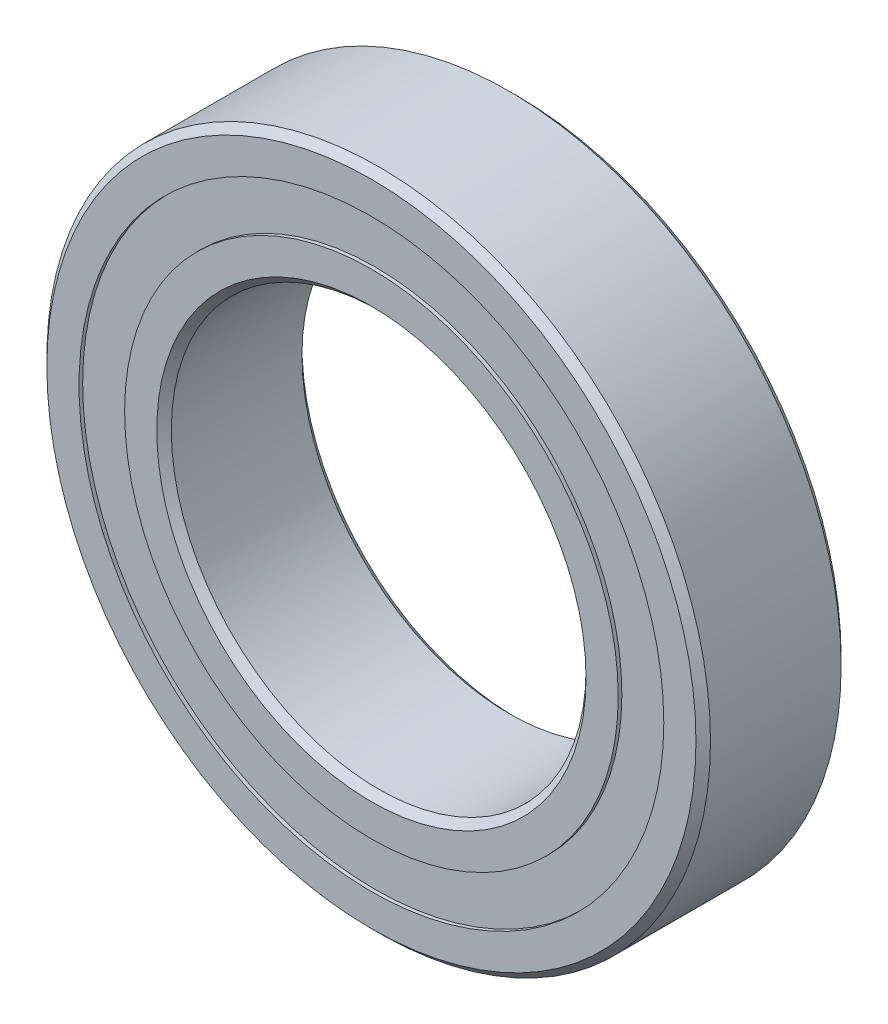
ISO-10303-21;
HEADER;
FILE_DESCRIPTION(('STEP AP214'),'2;1');
FILE_NAME('part.step','',(''),(''),'','','');
FILE_SCHEMA(('AUTOMOTIVE_DESIGN { 1 0 10303 214 1 1 1 1 }'));
ENDSEC;
DATA;
#1=APPLICATION_CONTEXT('core data for automotive mechanical design processes');
#2=APPLICATION_PROTOCOL_DEFINITION('international standard','automotive_design',2000,#1);
#3=PRODUCT_CONTEXT('',#1,'mechanical');
#4=PRODUCT('Part','Part','',(#3));
#5=PRODUCT_RELATED_PRODUCT_CATEGORY('part','',(#4));
#6=PRODUCT_DEFINITION_FORMATION('','',#4);
#7=PRODUCT_DEFINITION_CONTEXT('part definition',#1,'design');
#8=PRODUCT_DEFINITION('design','',#6,#7);
#9=PRODUCT_DEFINITION_SHAPE('','',#8);
#10=(LENGTH_UNIT() NAMED_UNIT(*) SI_UNIT(.MILLI.,.METRE.));
#11=(NAMED_UNIT(*) PLANE_ANGLE_UNIT() SI_UNIT($,.RADIAN.));
#12=(NAMED_UNIT(*) SI_UNIT($,.STERADIAN.) SOLID_ANGLE_UNIT());
#13=UNCERTAINTY_MEASURE_WITH_UNIT(LENGTH_MEASURE(1.E-05),#10,'distance_accuracy_value','');
#14=(GEOMETRIC_REPRESENTATION_CONTEXT(3) GLOBAL_UNCERTAINTY_ASSIGNED_CONTEXT((#13)) GLOBAL_UNIT_ASSIGNED_CONTEXT((#10,
#11,#12)) REPRESENTATION_CONTEXT('',''));
#15=CARTESIAN_POINT('',(0.,0.,0.));
#16=DIRECTION('',(0.,0.,1.));
#17=DIRECTION('',(1.,0.,0.));
#18=AXIS2_PLACEMENT_3D('',#15,#16,#17);
#19=CARTESIAN_POINT('',(-6.49999999999986,11.2583302491978,0.));
#20=DIRECTION('',(0.,0.,1.));
#21=DIRECTION('',(-0.499999999999989,0.866025403784445,0.));
#22=AXIS2_PLACEMENT_3D('',#19,#20,#21);
#23=SPHERICAL_SURFACE('',#22,1.90455682813241);
#24=CARTESIAN_POINT('',(-6.49999999999986,11.2583302491978,1.90455682813241));
#25=VERTEX_POINT('',#24);
#26=VERTEX_LOOP('',#25);
#27=FACE_BOUND('',#26,.T.);
#28=ADVANCED_FACE('F37',(#27),#23,.T.);
#29=CLOSED_SHELL('',(#28));
#30=MANIFOLD_SOLID_BREP('B2',#29);
#31=CARTESIAN_POINT('',(-11.2583302491976,6.50000000000013,0.));
#32=DIRECTION('',(0.,0.,1.));
#33=DIRECTION('',(-0.866025403784433,0.50000000000001,0.));
#34=AXIS2_PLACEMENT_3D('',#31,#32,#33);
#35=SPHERICAL_SURFACE('',#34,1.90455682813241);
#36=CARTESIAN_POINT('',(-11.2583302491976,6.50000000000013,1.90455682813241));
#37=VERTEX_POINT('',#36);
#38=VERTEX_LOOP('',#37);
#39=FACE_BOUND('',#38,.T.);
#40=ADVANCED_FACE('F57',(#39),#35,.T.);
#41=CLOSED_SHELL('',(#40));
#42=MANIFOLD_SOLID_BREP('B6',#41);
#43=CARTESIAN_POINT('',(-13.,1.36167772214882E-13,0.));
#44=DIRECTION('',(0.,0.,1.));
#45=DIRECTION('',(-1.,0.,0.));
#46=AXIS2_PLACEMENT_3D('',#43,#44,#45);
#47=SPHERICAL_SURFACE('',#46,1.90455682813241);
#48=CARTESIAN_POINT('',(-13.,1.36167772214882E-13,1.90455682813241));
#49=VERTEX_POINT('',#48);
#50=VERTEX_LOOP('',#49);
#51=FACE_BOUND('',#50,.T.);
#52=ADVANCED_FACE('F77',(#51),#47,.T.);
#53=CLOSED_SHELL('',(#52));
#54=MANIFOLD_SOLID_BREP('B33',#53);
#55=CARTESIAN_POINT('',(-11.2583302491978,-6.4999999999999,0.));
#56=DIRECTION('',(0.,0.,1.));
#57=DIRECTION('',(-0.866025403784443,-0.499999999999992,0.));
#58=AXIS2_PLACEMENT_3D('',#55,#56,#57);
#59=SPHERICAL_SURFACE('',#58,1.90455682813241);
#60=CARTESIAN_POINT('',(-11.2583302491978,-6.4999999999999,1.90455682813241));
#61=VERTEX_POINT('',#60);
#62=VERTEX_LOOP('',#61);
#63=FACE_BOUND('',#62,.T.);
#64=ADVANCED_FACE('F97',(#63),#59,.T.);
#65=CLOSED_SHELL('',(#64));
#66=MANIFOLD_SOLID_BREP('B53',#65);
#67=CARTESIAN_POINT('',(-6.50000000000009,-11.2583302491977,0.));
#68=DIRECTION('',(0.,0.,1.));
#69=DIRECTION('',(-0.500000000000007,-0.866025403784435,0.));
#70=AXIS2_PLACEMENT_3D('',#67,#68,#69);
#71=SPHERICAL_SURFACE('',#70,1.90455682813241);
#72=CARTESIAN_POINT('',(-6.50000000000009,-11.2583302491977,1.90455682813241));
#73=VERTEX_POINT('',#72);
#74=VERTEX_LOOP('',#73);
#75=FACE_BOUND('',#74,.T.);
#76=ADVANCED_FACE('F117',(#75),#71,.T.);
#77=CLOSED_SHELL('',(#76));
#78=MANIFOLD_SOLID_BREP('B73',#77);
#79=CARTESIAN_POINT('',(0.,-13.,0.));
#80=DIRECTION('',(0.,0.,1.));
#81=DIRECTION('',(0.,-1.,0.));
#82=AXIS2_PLACEMENT_3D('',#79,#80,#81);
#83=SPHERICAL_SURFACE('',#82,1.90455682813241);
#84=CARTESIAN_POINT('',(0.,-13.,1.90455682813241));
#85=VERTEX_POINT('',#84);
#86=VERTEX_LOOP('',#85);
#87=FACE_BOUND('',#86,.T.);
#88=ADVANCED_FACE('F137',(#87),#83,.T.);
#89=CLOSED_SHELL('',(#88));
#90=MANIFOLD_SOLID_BREP('B93',#89);
#91=CARTESIAN_POINT('',(6.49999999999994,-11.2583302491977,0.));
#92=DIRECTION('',(0.,0.,1.));
#93=DIRECTION('',(0.499999999999995,-0.866025403784442,0.));
#94=AXIS2_PLACEMENT_3D('',#91,#92,#93);
#95=SPHERICAL_SURFACE('',#94,1.90455682813241);
#96=CARTESIAN_POINT('',(6.49999999999994,-11.2583302491977,1.90455682813241));
#97=VERTEX_POINT('',#96);
#98=VERTEX_LOOP('',#97);
#99=FACE_BOUND('',#98,.T.);
#100=ADVANCED_FACE('F157',(#99),#95,.T.);
#101=CLOSED_SHELL('',(#100));
#102=MANIFOLD_SOLID_BREP('B113',#101);
#103=CARTESIAN_POINT('',(11.2583302491977,-6.50000000000006,0.));
#104=DIRECTION('',(0.,0.,1.));
#105=DIRECTION('',(0.866025403784436,-0.500000000000004,0.));
#106=AXIS2_PLACEMENT_3D('',#103,#104,#105);
#107=SPHERICAL_SURFACE('',#106,1.90455682813241);
#108=CARTESIAN_POINT('',(11.2583302491977,-6.50000000000006,1.90455682813241));
#109=VERTEX_POINT('',#108);
#110=VERTEX_LOOP('',#109);
#111=FACE_BOUND('',#110,.T.);
#112=ADVANCED_FACE('F177',(#111),#107,.T.);
#113=CLOSED_SHELL('',(#112));
#114=MANIFOLD_SOLID_BREP('B133',#113);
#115=CARTESIAN_POINT('',(13.,0.,0.));
#116=DIRECTION('',(0.,0.,1.));
#117=DIRECTION('',(1.,0.,0.));
#118=AXIS2_PLACEMENT_3D('',#115,#116,#117);
#119=SPHERICAL_SURFACE('',#118,1.90455682813241);
#120=CARTESIAN_POINT('',(13.,0.,1.90455682813241));
#121=VERTEX_POINT('',#120);
#122=VERTEX_LOOP('',#121);
#123=FACE_BOUND('',#122,.T.);
#124=ADVANCED_FACE('F197',(#123),#119,.T.);
#125=CLOSED_SHELL('',(#124));
#126=MANIFOLD_SOLID_BREP('B153',#125);
#127=CARTESIAN_POINT('',(11.2583302491977,6.49999999999998,0.));
#128=DIRECTION('',(0.,0.,1.));
#129=DIRECTION('',(0.86602540378444,0.499999999999998,0.));
#130=AXIS2_PLACEMENT_3D('',#127,#128,#129);
#131=SPHERICAL_SURFACE('',#130,1.90455682813241);
#132=CARTESIAN_POINT('',(11.2583302491977,6.49999999999998,1.90455682813241));
#133=VERTEX_POINT('',#132);
#134=VERTEX_LOOP('',#133);
#135=FACE_BOUND('',#134,.T.);
#136=ADVANCED_FACE('F217',(#135),#131,.T.);
#137=CLOSED_SHELL('',(#136));
#138=MANIFOLD_SOLID_BREP('B173',#137);
#139=CARTESIAN_POINT('',(6.50000000000002,11.2583302491977,0.));
#140=DIRECTION('',(0.,0.,1.));
#141=DIRECTION('',(0.500000000000001,0.866025403784438,0.));
#142=AXIS2_PLACEMENT_3D('',#139,#140,#141);
#143=SPHERICAL_SURFACE('',#142,1.90455682813241);
#144=CARTESIAN_POINT('',(6.50000000000002,11.2583302491977,1.90455682813241));
#145=VERTEX_POINT('',#144);
#146=VERTEX_LOOP('',#145);
#147=FACE_BOUND('',#146,.T.);
#148=ADVANCED_FACE('F237',(#147),#143,.T.);
#149=CLOSED_SHELL('',(#148));
#150=MANIFOLD_SOLID_BREP('B193',#149);
#151=CARTESIAN_POINT('',(0.,13.,0.));
#152=DIRECTION('',(0.,0.,1.));
#153=DIRECTION('',(0.,1.,0.));
#154=AXIS2_PLACEMENT_3D('',#151,#152,#153);
#155=SPHERICAL_SURFACE('',#154,1.90455682813241);
#156=CARTESIAN_POINT('',(0.,13.,1.90455682813241));
#157=VERTEX_POINT('',#156);
#158=VERTEX_LOOP('',#157);
#159=FACE_BOUND('',#158,.T.);
#160=ADVANCED_FACE('F258',(#159),#155,.T.);
#161=CLOSED_SHELL('',(#160));
#162=MANIFOLD_SOLID_BREP('B213',#161);
#163=CARTESIAN_POINT('',(0.,0.,3.5));
#164=DIRECTION('',(0.,0.,1.));
#165=DIRECTION('',(1.,0.,0.));
#166=AXIS2_PLACEMENT_3D('',#163,#164,#165);
#167=CYLINDRICAL_SURFACE('',#166,14.0989010989011);
#168=CARTESIAN_POINT('',(0.,0.,-3.5));
#169=DIRECTION('',(0.,0.,1.));
#170=DIRECTION('',(1.,0.,0.));
#171=AXIS2_PLACEMENT_3D('',#168,#169,#170);
#172=CIRCLE('',#171,14.0989010989011);
#173=CARTESIAN_POINT('',(14.0989010989011,0.,-3.5));
#174=VERTEX_POINT('',#173);
#175=EDGE_CURVE('E310',#174,#174,#172,.T.);
#176=ORIENTED_EDGE('',*,*,#175,.F.);
#177=EDGE_LOOP('',(#176));
#178=FACE_BOUND('',#177,.T.);
#179=CARTESIAN_POINT('',(0.,0.,-3.32500000000001));
#180=DIRECTION('',(0.,0.,1.));
#181=DIRECTION('',(1.,0.,0.));
#182=AXIS2_PLACEMENT_3D('',#179,#180,#181);
#183=CIRCLE('',#182,14.0989010989011);
#184=CARTESIAN_POINT('',(14.0989010989011,0.,-3.32500000000001));
#185=VERTEX_POINT('',#184);
#186=EDGE_CURVE('E257',#185,#185,#183,.F.);
#187=ORIENTED_EDGE('',*,*,#186,.F.);
#188=EDGE_LOOP('',(#187));
#189=FACE_BOUND('',#188,.T.);
#190=ADVANCED_FACE('F271',(#178,#189),#167,.F.);
#191=CARTESIAN_POINT('',(0.,0.,3.5));
#192=DIRECTION('',(0.,0.,1.));
#193=DIRECTION('',(1.,0.,0.));
#194=AXIS2_PLACEMENT_3D('',#191,#192,#193);
#195=CYLINDRICAL_SURFACE('',#194,11.9010989010989);
#196=CARTESIAN_POINT('',(0.,0.,-3.5));
#197=DIRECTION('',(0.,0.,1.));
#198=DIRECTION('',(1.,0.,0.));
#199=AXIS2_PLACEMENT_3D('',#196,#197,#198);
#200=CIRCLE('',#199,11.9010989010989);
#201=CARTESIAN_POINT('',(11.9010989010989,0.,-3.5));
#202=VERTEX_POINT('',#201);
#203=EDGE_CURVE('E337',#202,#202,#200,.T.);
#204=ORIENTED_EDGE('',*,*,#203,.T.);
#205=EDGE_LOOP('',(#204));
#206=FACE_BOUND('',#205,.T.);
#207=CARTESIAN_POINT('',(0.,0.,-3.32500000000001));
#208=DIRECTION('',(0.,0.,1.));
#209=DIRECTION('',(1.,0.,0.));
#210=AXIS2_PLACEMENT_3D('',#207,#208,#209);
#211=CIRCLE('',#210,11.9010989010989);
#212=CARTESIAN_POINT('',(11.9010989010989,0.,-3.32500000000001));
#213=VERTEX_POINT('',#212);
#214=EDGE_CURVE('E283',#213,#213,#211,.T.);
#215=ORIENTED_EDGE('',*,*,#214,.F.);
#216=EDGE_LOOP('',(#215));
#217=FACE_BOUND('',#216,.T.);
#218=ADVANCED_FACE('F379',(#206,#217),#195,.T.);
#219=CARTESIAN_POINT('',(0.,0.,3.5));
#220=DIRECTION('',(0.,0.,1.));
#221=DIRECTION('',(1.,0.,0.));
#222=AXIS2_PLACEMENT_3D('',#219,#220,#221);
#223=CYLINDRICAL_SURFACE('',#222,14.0989010989011);
#224=CARTESIAN_POINT('',(0.,0.,3.5));
#225=DIRECTION('',(0.,0.,1.));
#226=DIRECTION('',(1.,0.,0.));
#227=AXIS2_PLACEMENT_3D('',#224,#225,#226);
#228=CIRCLE('',#227,14.0989010989011);
#229=CARTESIAN_POINT('',(14.0989010989011,0.,3.5));
#230=VERTEX_POINT('',#229);
#231=EDGE_CURVE('E301',#230,#230,#228,.T.);
#232=ORIENTED_EDGE('',*,*,#231,.T.);
#233=EDGE_LOOP('',(#232));
#234=FACE_BOUND('',#233,.T.);
#235=CARTESIAN_POINT('',(0.,0.,3.32500000000001));
#236=DIRECTION('',(0.,0.,-1.));
#237=DIRECTION('',(-1.,0.,0.));
#238=AXIS2_PLACEMENT_3D('',#235,#236,#237);
#239=CIRCLE('',#238,14.0989010989011);
#240=CARTESIAN_POINT('',(-14.0989010989011,0.,3.32500000000001));
#241=VERTEX_POINT('',#240);
#242=EDGE_CURVE('E292',#241,#241,#239,.F.);
#243=ORIENTED_EDGE('',*,*,#242,.F.);
#244=EDGE_LOOP('',(#243));
#245=FACE_BOUND('',#244,.T.);
#246=ADVANCED_FACE('F377',(#234,#245),#223,.F.);
#247=CARTESIAN_POINT('',(0.,0.,3.15));
#248=DIRECTION('',(0.,0.,-1.));
#249=DIRECTION('',(-1.,0.,0.));
#250=AXIS2_PLACEMENT_3D('',#247,#248,#249);
#251=CONICAL_SURFACE('',#250,16.,0.78539816339743);
#252=CARTESIAN_POINT('',(0.,0.,3.5));
#253=DIRECTION('',(0.,0.,1.));
#254=DIRECTION('',(1.,0.,0.));
#255=AXIS2_PLACEMENT_3D('',#252,#253,#254);
#256=CIRCLE('',#255,15.65);
#257=CARTESIAN_POINT('',(15.65,0.,3.5));
#258=VERTEX_POINT('',#257);
#259=EDGE_CURVE('E298',#258,#258,#256,.T.);
#260=ORIENTED_EDGE('',*,*,#259,.F.);
#261=EDGE_LOOP('',(#260));
#262=FACE_BOUND('',#261,.T.);
#263=CARTESIAN_POINT('',(0.,0.,3.15));
#264=DIRECTION('',(0.,0.,1.));
#265=DIRECTION('',(1.,0.,0.));
#266=AXIS2_PLACEMENT_3D('',#263,#264,#265);
#267=CIRCLE('',#266,16.);
#268=CARTESIAN_POINT('',(16.,0.,3.15));
#269=VERTEX_POINT('',#268);
#270=EDGE_CURVE('E319',#269,#269,#267,.T.);
#271=ORIENTED_EDGE('',*,*,#270,.T.);
#272=EDGE_LOOP('',(#271));
#273=FACE_BOUND('',#272,.T.);
#274=ADVANCED_FACE('F273',(#262,#273),#251,.T.);
#275=CARTESIAN_POINT('',(0.,15.65,3.5));
#276=DIRECTION('',(0.,0.,-1.));
#277=DIRECTION('',(-1.,0.,0.));
#278=AXIS2_PLACEMENT_3D('',#275,#276,#277);
#279=PLANE('',#278);
#280=ORIENTED_EDGE('',*,*,#231,.F.);
#281=EDGE_LOOP('',(#280));
#282=FACE_BOUND('',#281,.T.);
#283=ORIENTED_EDGE('',*,*,#259,.T.);
#284=EDGE_LOOP('',(#283));
#285=FACE_BOUND('',#284,.T.);
#286=ADVANCED_FACE('F387',(#282,#285),#279,.F.);
#287=CARTESIAN_POINT('',(0.,15.65,-3.5));
#288=DIRECTION('',(0.,0.,1.));
#289=DIRECTION('',(1.,0.,0.));
#290=AXIS2_PLACEMENT_3D('',#287,#288,#289);
#291=PLANE('',#290);
#292=CARTESIAN_POINT('',(0.,0.,-3.5));
#293=DIRECTION('',(0.,0.,1.));
#294=DIRECTION('',(1.,0.,0.));
#295=AXIS2_PLACEMENT_3D('',#292,#293,#294);
#296=CIRCLE('',#295,15.65);
#297=CARTESIAN_POINT('',(15.65,0.,-3.5));
#298=VERTEX_POINT('',#297);
#299=EDGE_CURVE('E313',#298,#298,#296,.T.);
#300=ORIENTED_EDGE('',*,*,#299,.F.);
#301=EDGE_LOOP('',(#300));
#302=FACE_BOUND('',#301,.T.);
#303=ORIENTED_EDGE('',*,*,#175,.T.);
#304=EDGE_LOOP('',(#303));
#305=FACE_BOUND('',#304,.T.);
#306=ADVANCED_FACE('F449',(#302,#305),#291,.F.);
#307=CARTESIAN_POINT('',(0.,0.,-3.5));
#308=DIRECTION('',(0.,0.,1.));
#309=DIRECTION('',(1.,0.,0.));
#310=AXIS2_PLACEMENT_3D('',#307,#308,#309);
#311=CONICAL_SURFACE('',#310,15.65,0.785398163397459);
#312=CARTESIAN_POINT('',(0.,0.,-3.15));
#313=DIRECTION('',(0.,0.,1.));
#314=DIRECTION('',(1.,0.,0.));
#315=AXIS2_PLACEMENT_3D('',#312,#313,#314);
#316=CIRCLE('',#315,16.);
#317=CARTESIAN_POINT('',(16.,0.,-3.15));
#318=VERTEX_POINT('',#317);
#319=EDGE_CURVE('E316',#318,#318,#316,.T.);
#320=ORIENTED_EDGE('',*,*,#319,.F.);
#321=EDGE_LOOP('',(#320));
#322=FACE_BOUND('',#321,.T.);
#323=ORIENTED_EDGE('',*,*,#299,.T.);
#324=EDGE_LOOP('',(#323));
#325=FACE_BOUND('',#324,.T.);
#326=ADVANCED_FACE('F446',(#322,#325),#311,.T.);
#327=CARTESIAN_POINT('',(0.,0.,3.5));
#328=DIRECTION('',(0.,0.,1.));
#329=DIRECTION('',(1.,0.,0.));
#330=AXIS2_PLACEMENT_3D('',#327,#328,#329);
#331=CYLINDRICAL_SURFACE('',#330,16.);
#332=ORIENTED_EDGE('',*,*,#270,.F.);
#333=EDGE_LOOP('',(#332));
#334=FACE_BOUND('',#333,.T.);
#335=ORIENTED_EDGE('',*,*,#319,.T.);
#336=EDGE_LOOP('',(#335));
#337=FACE_BOUND('',#336,.T.);
#338=ADVANCED_FACE('F373',(#334,#337),#331,.T.);
#339=CARTESIAN_POINT('',(0.,14.0989010989011,3.32500000000001));
#340=DIRECTION('',(0.,0.,-1.));
#341=DIRECTION('',(-1.,0.,0.));
#342=AXIS2_PLACEMENT_3D('',#339,#340,#341);
#343=PLANE('',#342);
#344=CARTESIAN_POINT('',(0.,0.,3.32500000000001));
#345=DIRECTION('',(0.,0.,1.));
#346=DIRECTION('',(1.,0.,0.));
#347=AXIS2_PLACEMENT_3D('',#344,#345,#346);
#348=CIRCLE('',#347,11.9010989010989);
#349=CARTESIAN_POINT('',(11.9010989010989,0.,3.32500000000001));
#350=VERTEX_POINT('',#349);
#351=EDGE_CURVE('E322',#350,#350,#348,.T.);
#352=ORIENTED_EDGE('',*,*,#351,.F.);
#353=EDGE_LOOP('',(#352));
#354=FACE_BOUND('',#353,.T.);
#355=ORIENTED_EDGE('',*,*,#242,.T.);
#356=EDGE_LOOP('',(#355));
#357=FACE_BOUND('',#356,.T.);
#358=ADVANCED_FACE('F366',(#354,#357),#343,.F.);
#359=CARTESIAN_POINT('',(0.,0.,3.5));
#360=DIRECTION('',(0.,0.,1.));
#361=DIRECTION('',(1.,0.,0.));
#362=AXIS2_PLACEMENT_3D('',#359,#360,#361);
#363=CYLINDRICAL_SURFACE('',#362,11.9010989010989);
#364=CARTESIAN_POINT('',(0.,0.,3.5));
#365=DIRECTION('',(0.,0.,1.));
#366=DIRECTION('',(1.,0.,0.));
#367=AXIS2_PLACEMENT_3D('',#364,#365,#366);
#368=CIRCLE('',#367,11.9010989010989);
#369=CARTESIAN_POINT('',(11.9010989010989,0.,3.5));
#370=VERTEX_POINT('',#369);
#371=EDGE_CURVE('E346',#370,#370,#368,.T.);
#372=ORIENTED_EDGE('',*,*,#371,.F.);
#373=EDGE_LOOP('',(#372));
#374=FACE_BOUND('',#373,.T.);
#375=ORIENTED_EDGE('',*,*,#351,.T.);
#376=EDGE_LOOP('',(#375));
#377=FACE_BOUND('',#376,.T.);
#378=ADVANCED_FACE('F363',(#374,#377),#363,.T.);
#379=CARTESIAN_POINT('',(0.,0.,3.5));
#380=DIRECTION('',(0.,0.,1.));
#381=DIRECTION('',(1.,0.,0.));
#382=AXIS2_PLACEMENT_3D('',#379,#380,#381);
#383=CONICAL_SURFACE('',#382,10.35,0.785398163397462);
#384=CARTESIAN_POINT('',(0.,0.,3.15));
#385=DIRECTION('',(0.,0.,1.));
#386=DIRECTION('',(1.,0.,0.));
#387=AXIS2_PLACEMENT_3D('',#384,#385,#386);
#388=CIRCLE('',#387,10.);
#389=CARTESIAN_POINT('',(10.,0.,3.15));
#390=VERTEX_POINT('',#389);
#391=EDGE_CURVE('E328',#390,#390,#388,.T.);
#392=ORIENTED_EDGE('',*,*,#391,.F.);
#393=EDGE_LOOP('',(#392));
#394=FACE_BOUND('',#393,.T.);
#395=CARTESIAN_POINT('',(0.,0.,3.5));
#396=DIRECTION('',(0.,0.,1.));
#397=DIRECTION('',(1.,0.,0.));
#398=AXIS2_PLACEMENT_3D('',#395,#396,#397);
#399=CIRCLE('',#398,10.35);
#400=CARTESIAN_POINT('',(10.35,0.,3.5));
#401=VERTEX_POINT('',#400);
#402=EDGE_CURVE('E349',#401,#401,#399,.T.);
#403=ORIENTED_EDGE('',*,*,#402,.T.);
#404=EDGE_LOOP('',(#403));
#405=FACE_BOUND('',#404,.T.);
#406=ADVANCED_FACE('F353',(#394,#405),#383,.F.);
#407=CARTESIAN_POINT('',(0.,0.,3.5));
#408=DIRECTION('',(0.,0.,1.));
#409=DIRECTION('',(1.,0.,0.));
#410=AXIS2_PLACEMENT_3D('',#407,#408,#409);
#411=CYLINDRICAL_SURFACE('',#410,10.);
#412=CARTESIAN_POINT('',(0.,0.,-3.15));
#413=DIRECTION('',(0.,0.,1.));
#414=DIRECTION('',(1.,0.,0.));
#415=AXIS2_PLACEMENT_3D('',#412,#413,#414);
#416=CIRCLE('',#415,10.);
#417=CARTESIAN_POINT('',(10.,0.,-3.15));
#418=VERTEX_POINT('',#417);
#419=EDGE_CURVE('E331',#418,#418,#416,.T.);
#420=ORIENTED_EDGE('',*,*,#419,.F.);
#421=EDGE_LOOP('',(#420));
#422=FACE_BOUND('',#421,.T.);
#423=ORIENTED_EDGE('',*,*,#391,.T.);
#424=EDGE_LOOP('',(#423));
#425=FACE_BOUND('',#424,.T.);
#426=ADVANCED_FACE('F436',(#422,#425),#411,.F.);
#427=CARTESIAN_POINT('',(0.,0.,-3.15));
#428=DIRECTION('',(0.,0.,-1.));
#429=DIRECTION('',(-1.,0.,0.));
#430=AXIS2_PLACEMENT_3D('',#427,#428,#429);
#431=CONICAL_SURFACE('',#430,10.,0.785398163397462);
#432=CARTESIAN_POINT('',(0.,0.,-3.5));
#433=DIRECTION('',(0.,0.,1.));
#434=DIRECTION('',(1.,0.,0.));
#435=AXIS2_PLACEMENT_3D('',#432,#433,#434);
#436=CIRCLE('',#435,10.35);
#437=CARTESIAN_POINT('',(10.35,0.,-3.5));
#438=VERTEX_POINT('',#437);
#439=EDGE_CURVE('E334',#438,#438,#436,.T.);
#440=ORIENTED_EDGE('',*,*,#439,.F.);
#441=EDGE_LOOP('',(#440));
#442=FACE_BOUND('',#441,.T.);
#443=ORIENTED_EDGE('',*,*,#419,.T.);
#444=EDGE_LOOP('',(#443));
#445=FACE_BOUND('',#444,.T.);
#446=ADVANCED_FACE('F432',(#442,#445),#431,.F.);
#447=CARTESIAN_POINT('',(0.,10.35,-3.5));
#448=DIRECTION('',(0.,0.,1.));
#449=DIRECTION('',(1.,0.,0.));
#450=AXIS2_PLACEMENT_3D('',#447,#448,#449);
#451=PLANE('',#450);
#452=ORIENTED_EDGE('',*,*,#203,.F.);
#453=EDGE_LOOP('',(#452));
#454=FACE_BOUND('',#453,.T.);
#455=ORIENTED_EDGE('',*,*,#439,.T.);
#456=EDGE_LOOP('',(#455));
#457=FACE_BOUND('',#456,.T.);
#458=ADVANCED_FACE('F359',(#454,#457),#451,.F.);
#459=CARTESIAN_POINT('',(0.,10.35,3.5));
#460=DIRECTION('',(0.,0.,-1.));
#461=DIRECTION('',(-1.,0.,0.));
#462=AXIS2_PLACEMENT_3D('',#459,#460,#461);
#463=PLANE('',#462);
#464=ORIENTED_EDGE('',*,*,#402,.F.);
#465=EDGE_LOOP('',(#464));
#466=FACE_BOUND('',#465,.T.);
#467=ORIENTED_EDGE('',*,*,#371,.T.);
#468=EDGE_LOOP('',(#467));
#469=FACE_BOUND('',#468,.T.);
#470=ADVANCED_FACE('F355',(#466,#469),#463,.F.);
#471=CARTESIAN_POINT('',(0.,14.0989010989011,-3.32500000000001));
#472=DIRECTION('',(0.,0.,1.));
#473=DIRECTION('',(1.,0.,0.));
#474=AXIS2_PLACEMENT_3D('',#471,#472,#473);
#475=PLANE('',#474);
#476=ORIENTED_EDGE('',*,*,#186,.T.);
#477=EDGE_LOOP('',(#476));
#478=FACE_BOUND('',#477,.T.);
#479=ORIENTED_EDGE('',*,*,#214,.T.);
#480=EDGE_LOOP('',(#479));
#481=FACE_BOUND('',#480,.T.);
#482=ADVANCED_FACE('F358',(#478,#481),#475,.F.);
#483=CLOSED_SHELL('',(#190,#218,#246,#274,#286,#306,#326,#338,#358,#378,#406,#426,#446,#458,
#470,#482));
#484=CARTESIAN_POINT('',(0.,14.0989010989011,-1.90455682813242));
#485=DIRECTION('',(0.,0.,-1.));
#486=DIRECTION('',(-1.,0.,0.));
#487=AXIS2_PLACEMENT_3D('',#484,#485,#486);
#488=PLANE('',#487);
#489=CARTESIAN_POINT('',(0.,0.,-1.90455682813242));
#490=DIRECTION('',(0.,0.,-1.));
#491=DIRECTION('',(-1.,0.,0.));
#492=AXIS2_PLACEMENT_3D('',#489,#490,#491);
#493=CIRCLE('',#492,11.9010989010989);
#494=CARTESIAN_POINT('',(-11.9010989010989,0.,-1.90455682813242));
#495=VERTEX_POINT('',#494);
#496=EDGE_CURVE('E287',#495,#495,#493,.T.);
#497=ORIENTED_EDGE('',*,*,#496,.T.);
#498=EDGE_LOOP('',(#497));
#499=FACE_BOUND('',#498,.T.);
#500=CARTESIAN_POINT('',(0.,0.,-1.90455682813242));
#501=DIRECTION('',(0.,0.,-1.));
#502=DIRECTION('',(-1.,0.,0.));
#503=AXIS2_PLACEMENT_3D('',#500,#501,#502);
#504=CIRCLE('',#503,14.0989010989011);
#505=CARTESIAN_POINT('',(-14.0989010989011,0.,-1.90455682813242));
#506=VERTEX_POINT('',#505);
#507=EDGE_CURVE('E279',#506,#506,#504,.F.);
#508=ORIENTED_EDGE('',*,*,#507,.T.);
#509=EDGE_LOOP('',(#508));
#510=FACE_BOUND('',#509,.T.);
#511=ADVANCED_FACE('F395',(#499,#510),#488,.F.);
#512=CARTESIAN_POINT('',(0.,0.,1.55555555555556));
#513=DIRECTION('',(0.,0.,1.));
#514=DIRECTION('',(1.,0.,0.));
#515=AXIS2_PLACEMENT_3D('',#512,#513,#514);
#516=CIRCLE('',#515,14.0989010989011);
#517=CARTESIAN_POINT('',(14.0989010989011,0.,1.55555555555556));
#518=VERTEX_POINT('',#517);
#519=EDGE_CURVE('E304',#518,#518,#516,.T.);
#520=ORIENTED_EDGE('',*,*,#519,.F.);
#521=EDGE_LOOP('',(#520));
#522=FACE_BOUND('',#521,.T.);
#523=CARTESIAN_POINT('',(0.,0.,1.90455682813241));
#524=DIRECTION('',(0.,0.,1.));
#525=DIRECTION('',(1.,0.,0.));
#526=AXIS2_PLACEMENT_3D('',#523,#524,#525);
#527=CIRCLE('',#526,14.0989010989011);
#528=CARTESIAN_POINT('',(14.0989010989011,0.,1.90455682813241));
#529=VERTEX_POINT('',#528);
#530=EDGE_CURVE('E295',#529,#529,#527,.F.);
#531=ORIENTED_EDGE('',*,*,#530,.F.);
#532=EDGE_LOOP('',(#531));
#533=FACE_BOUND('',#532,.T.);
#534=ADVANCED_FACE('F382',(#522,#533),#223,.F.);
#535=CARTESIAN_POINT('',(0.,0.,0.));
#536=DIRECTION('',(0.,0.,1.));
#537=DIRECTION('',(1.,0.,0.));
#538=AXIS2_PLACEMENT_3D('',#535,#536,#537);
#539=TOROIDAL_SURFACE('',#538,13.,1.90455682813241);
#540=CARTESIAN_POINT('',(0.,0.,-1.55555555555556));
#541=DIRECTION('',(0.,0.,1.));
#542=DIRECTION('',(1.,0.,0.));
#543=AXIS2_PLACEMENT_3D('',#540,#541,#542);
#544=CIRCLE('',#543,14.0989010989011);
#545=CARTESIAN_POINT('',(14.0989010989011,0.,-1.55555555555556));
#546=VERTEX_POINT('',#545);
#547=EDGE_CURVE('E307',#546,#546,#544,.T.);
#548=ORIENTED_EDGE('',*,*,#547,.F.);
#549=EDGE_LOOP('',(#548));
#550=FACE_BOUND('',#549,.T.);
#551=ORIENTED_EDGE('',*,*,#519,.T.);
#552=EDGE_LOOP('',(#551));
#553=FACE_BOUND('',#552,.T.);
#554=ADVANCED_FACE('F394',(#550,#553),#539,.F.);
#555=ORIENTED_EDGE('',*,*,#547,.T.);
#556=EDGE_LOOP('',(#555));
#557=FACE_BOUND('',#556,.T.);
#558=ORIENTED_EDGE('',*,*,#507,.F.);
#559=EDGE_LOOP('',(#558));
#560=FACE_BOUND('',#559,.T.);
#561=ADVANCED_FACE('F401',(#557,#560),#167,.F.);
#562=CARTESIAN_POINT('',(0.,14.0989010989011,1.90455682813241));
#563=DIRECTION('',(0.,0.,1.));
#564=DIRECTION('',(1.,0.,0.));
#565=AXIS2_PLACEMENT_3D('',#562,#563,#564);
#566=PLANE('',#565);
#567=ORIENTED_EDGE('',*,*,#530,.T.);
#568=EDGE_LOOP('',(#567));
#569=FACE_BOUND('',#568,.T.);
#570=CARTESIAN_POINT('',(0.,0.,1.90455682813241));
#571=DIRECTION('',(0.,0.,1.));
#572=DIRECTION('',(1.,0.,0.));
#573=AXIS2_PLACEMENT_3D('',#570,#571,#572);
#574=CIRCLE('',#573,11.9010989010989);
#575=CARTESIAN_POINT('',(11.9010989010989,0.,1.90455682813241));
#576=VERTEX_POINT('',#575);
#577=EDGE_CURVE('E325',#576,#576,#574,.F.);
#578=ORIENTED_EDGE('',*,*,#577,.F.);
#579=EDGE_LOOP('',(#578));
#580=FACE_BOUND('',#579,.T.);
#581=ADVANCED_FACE('F408',(#569,#580),#566,.F.);
#582=CARTESIAN_POINT('',(0.,0.,1.55555555555556));
#583=DIRECTION('',(0.,0.,1.));
#584=DIRECTION('',(1.,0.,0.));
#585=AXIS2_PLACEMENT_3D('',#582,#583,#584);
#586=CIRCLE('',#585,11.9010989010989);
#587=CARTESIAN_POINT('',(11.9010989010989,0.,1.55555555555556));
#588=VERTEX_POINT('',#587);
#589=EDGE_CURVE('E343',#588,#588,#586,.T.);
#590=ORIENTED_EDGE('',*,*,#589,.T.);
#591=EDGE_LOOP('',(#590));
#592=FACE_BOUND('',#591,.T.);
#593=ORIENTED_EDGE('',*,*,#577,.T.);
#594=EDGE_LOOP('',(#593));
#595=FACE_BOUND('',#594,.T.);
#596=ADVANCED_FACE('F368',(#592,#595),#363,.T.);
#597=CARTESIAN_POINT('',(0.,0.,0.));
#598=DIRECTION('',(0.,0.,1.));
#599=DIRECTION('',(1.,0.,0.));
#600=AXIS2_PLACEMENT_3D('',#597,#598,#599);
#601=TOROIDAL_SURFACE('',#600,13.,1.90455682813241);
#602=ORIENTED_EDGE('',*,*,#589,.F.);
#603=EDGE_LOOP('',(#602));
#604=FACE_BOUND('',#603,.T.);
#605=CARTESIAN_POINT('',(0.,0.,-1.55555555555556));
#606=DIRECTION('',(0.,0.,1.));
#607=DIRECTION('',(1.,0.,0.));
#608=AXIS2_PLACEMENT_3D('',#605,#606,#607);
#609=CIRCLE('',#608,11.9010989010989);
#610=CARTESIAN_POINT('',(11.9010989010989,0.,-1.55555555555556));
#611=VERTEX_POINT('',#610);
#612=EDGE_CURVE('E340',#611,#611,#609,.T.);
#613=ORIENTED_EDGE('',*,*,#612,.T.);
#614=EDGE_LOOP('',(#613));
#615=FACE_BOUND('',#614,.T.);
#616=ADVANCED_FACE('F426',(#604,#615),#601,.F.);
#617=ORIENTED_EDGE('',*,*,#612,.F.);
#618=EDGE_LOOP('',(#617));
#619=FACE_BOUND('',#618,.T.);
#620=ORIENTED_EDGE('',*,*,#496,.F.);
#621=EDGE_LOOP('',(#620));
#622=FACE_BOUND('',#621,.T.);
#623=ADVANCED_FACE('F391',(#619,#622),#195,.T.);
#624=CLOSED_SHELL('',(#511,#534,#554,#561,#581,#596,#616,#623));
#625=ORIENTED_CLOSED_SHELL('',*,#624,.T.);
#626=BREP_WITH_VOIDS('B233',#483,(#625));
#627=ADVANCED_BREP_SHAPE_REPRESENTATION('',(#18,#30,#42,#54,#66,#78,#90,#102,#114,#126,#138,
#150,#162,#626),#14);
#628=SHAPE_DEFINITION_REPRESENTATION(#9,#627);
ENDSEC;
END-ISO-10303-21;
